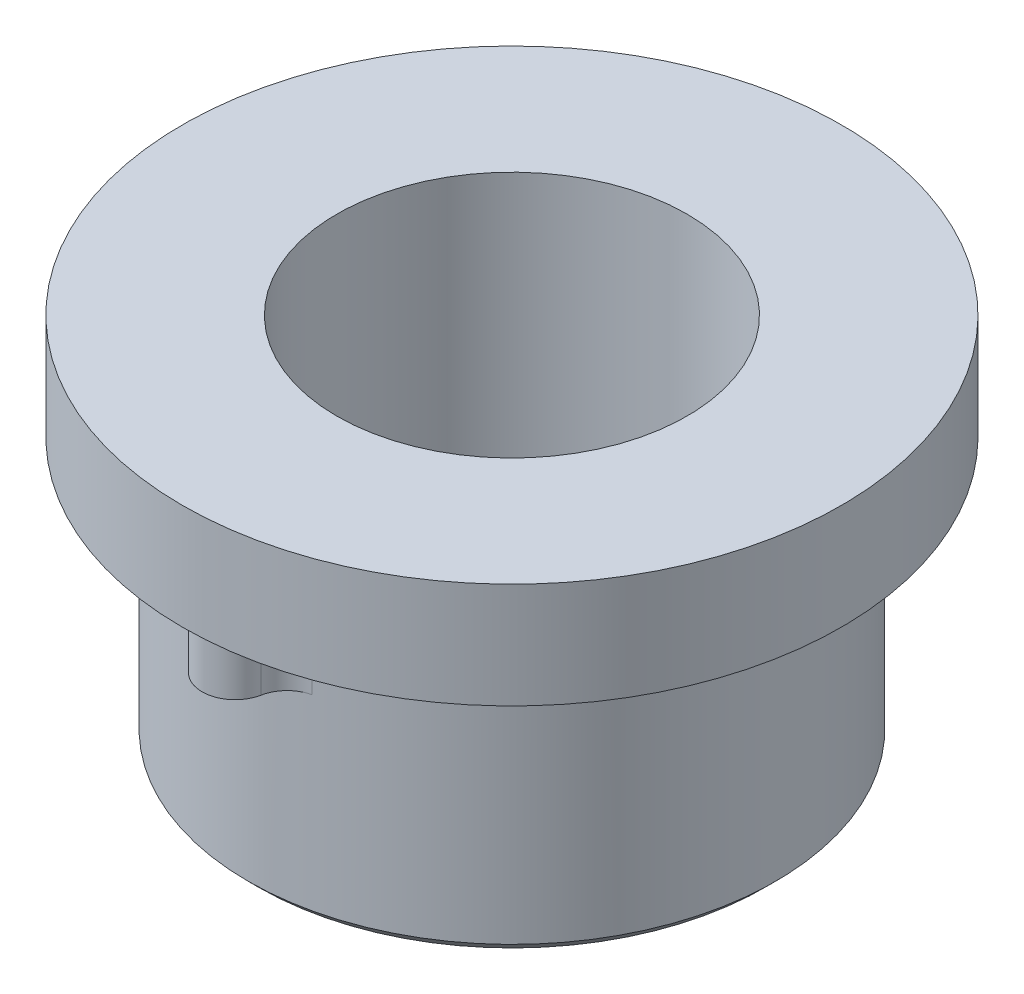
ISO-10303-21;
HEADER;
FILE_DESCRIPTION(('STEP AP214'),'2;1');
FILE_NAME('part.step','',(''),(''),'','','');
FILE_SCHEMA(('AUTOMOTIVE_DESIGN { 1 0 10303 214 1 1 1 1 }'));
ENDSEC;
DATA;
#1=APPLICATION_CONTEXT('core data for automotive mechanical design processes');
#2=APPLICATION_PROTOCOL_DEFINITION('international standard','automotive_design',2000,#1);
#3=PRODUCT_CONTEXT('',#1,'mechanical');
#4=PRODUCT('Part','Part','',(#3));
#5=PRODUCT_RELATED_PRODUCT_CATEGORY('part','',(#4));
#6=PRODUCT_DEFINITION_FORMATION('','',#4);
#7=PRODUCT_DEFINITION_CONTEXT('part definition',#1,'design');
#8=PRODUCT_DEFINITION('design','',#6,#7);
#9=PRODUCT_DEFINITION_SHAPE('','',#8);
#10=(LENGTH_UNIT() NAMED_UNIT(*) SI_UNIT(.MILLI.,.METRE.));
#11=(NAMED_UNIT(*) PLANE_ANGLE_UNIT() SI_UNIT($,.RADIAN.));
#12=(NAMED_UNIT(*) SI_UNIT($,.STERADIAN.) SOLID_ANGLE_UNIT());
#13=UNCERTAINTY_MEASURE_WITH_UNIT(LENGTH_MEASURE(1.E-05),#10,'distance_accuracy_value','');
#14=(GEOMETRIC_REPRESENTATION_CONTEXT(3) GLOBAL_UNCERTAINTY_ASSIGNED_CONTEXT((#13)) GLOBAL_UNIT_ASSIGNED_CONTEXT((#10,
#11,#12)) REPRESENTATION_CONTEXT('',''));
#15=CARTESIAN_POINT('',(0.,0.,0.));
#16=DIRECTION('',(0.,0.,1.));
#17=DIRECTION('',(1.,0.,0.));
#18=AXIS2_PLACEMENT_3D('',#15,#16,#17);
#19=CARTESIAN_POINT('',(0.,6.35,0.));
#20=DIRECTION('',(0.,-1.,0.));
#21=DIRECTION('',(0.,0.,-1.));
#22=AXIS2_PLACEMENT_3D('',#19,#20,#21);
#23=CYLINDRICAL_SURFACE('',#22,6.35);
#24=CARTESIAN_POINT('',(0.,0.253999999999997,0.));
#25=DIRECTION('',(0.,1.,0.));
#26=DIRECTION('',(0.,0.,1.));
#27=AXIS2_PLACEMENT_3D('',#24,#25,#26);
#28=CIRCLE('',#27,6.35);
#29=CARTESIAN_POINT('',(0.,0.253999999999997,6.35));
#30=VERTEX_POINT('',#29);
#31=EDGE_CURVE('E151',#30,#30,#28,.T.);
#32=ORIENTED_EDGE('',*,*,#31,.T.);
#33=EDGE_LOOP('',(#32));
#34=FACE_BOUND('',#33,.T.);
#35=CARTESIAN_POINT('',(0.,4.7625,0.));
#36=DIRECTION('',(0.,-1.,0.));
#37=DIRECTION('',(0.,0.,-1.));
#38=AXIS2_PLACEMENT_3D('',#35,#36,#37);
#39=CIRCLE('',#38,6.35);
#40=CARTESIAN_POINT('',(-1.38494922418352,4.7625,-6.19712962962963));
#41=VERTEX_POINT('',#40);
#42=CARTESIAN_POINT('',(1.38494922418352,4.7625,-6.19712962962963));
#43=VERTEX_POINT('',#42);
#44=EDGE_CURVE('E148',#41,#43,#39,.T.);
#45=ORIENTED_EDGE('',*,*,#44,.T.);
#46=DIRECTION('',(0.,-1.,0.));
#47=VECTOR('',#46,1.);
#48=CARTESIAN_POINT('',(1.38494922418352,6.35,-6.19712962962963));
#49=LINE('',#48,#47);
#50=CARTESIAN_POINT('',(1.38494922418352,6.35,-6.19712962962963));
#51=VERTEX_POINT('',#50);
#52=EDGE_CURVE('E163',#43,#51,#49,.F.);
#53=ORIENTED_EDGE('',*,*,#52,.T.);
#54=CARTESIAN_POINT('',(0.,6.35,0.));
#55=DIRECTION('',(0.,1.,0.));
#56=DIRECTION('',(0.,0.,1.));
#57=AXIS2_PLACEMENT_3D('',#54,#55,#56);
#58=CIRCLE('',#57,6.35);
#59=CARTESIAN_POINT('',(1.38494922418352,6.35,6.19712962962963));
#60=VERTEX_POINT('',#59);
#61=EDGE_CURVE('E146',#60,#51,#58,.T.);
#62=ORIENTED_EDGE('',*,*,#61,.F.);
#63=DIRECTION('',(0.,-1.,0.));
#64=VECTOR('',#63,1.);
#65=CARTESIAN_POINT('',(1.38494922418352,6.35,6.19712962962963));
#66=LINE('',#65,#64);
#67=CARTESIAN_POINT('',(1.38494922418352,4.7625,6.19712962962963));
#68=VERTEX_POINT('',#67);
#69=EDGE_CURVE('E157',#60,#68,#66,.T.);
#70=ORIENTED_EDGE('',*,*,#69,.T.);
#71=CARTESIAN_POINT('',(-1.38494922418352,4.7625,6.19712962962963));
#72=VERTEX_POINT('',#71);
#73=EDGE_CURVE('E150',#68,#72,#39,.T.);
#74=ORIENTED_EDGE('',*,*,#73,.T.);
#75=DIRECTION('',(0.,-1.,0.));
#76=VECTOR('',#75,1.);
#77=CARTESIAN_POINT('',(-1.38494922418352,6.35,6.19712962962963));
#78=LINE('',#77,#76);
#79=CARTESIAN_POINT('',(-1.38494922418352,6.35,6.19712962962963));
#80=VERTEX_POINT('',#79);
#81=EDGE_CURVE('E160',#72,#80,#78,.F.);
#82=ORIENTED_EDGE('',*,*,#81,.T.);
#83=CARTESIAN_POINT('',(-1.38494922418352,6.35,-6.19712962962963));
#84=VERTEX_POINT('',#83);
#85=EDGE_CURVE('E142',#84,#80,#58,.T.);
#86=ORIENTED_EDGE('',*,*,#85,.F.);
#87=DIRECTION('',(0.,-1.,0.));
#88=VECTOR('',#87,1.);
#89=CARTESIAN_POINT('',(-1.38494922418352,6.35,-6.19712962962963));
#90=LINE('',#89,#88);
#91=EDGE_CURVE('E104',#84,#41,#90,.T.);
#92=ORIENTED_EDGE('',*,*,#91,.T.);
#93=EDGE_LOOP('',(#45,#53,#62,#70,#74,#82,#86,#92));
#94=FACE_BOUND('',#93,.T.);
#95=ADVANCED_FACE('F33',(#34,#94),#23,.T.);
#96=CARTESIAN_POINT('',(0.,6.35,0.));
#97=DIRECTION('',(0.,1.,0.));
#98=DIRECTION('',(0.,0.,1.));
#99=AXIS2_PLACEMENT_3D('',#96,#97,#98);
#100=PLANE('',#99);
#101=CARTESIAN_POINT('',(0.,6.35,0.));
#102=DIRECTION('',(0.,1.,0.));
#103=DIRECTION('',(0.,0.,1.));
#104=AXIS2_PLACEMENT_3D('',#101,#102,#103);
#105=CIRCLE('',#104,7.9375);
#106=CARTESIAN_POINT('',(0.,6.35,7.9375));
#107=VERTEX_POINT('',#106);
#108=EDGE_CURVE('E143',#107,#107,#105,.T.);
#109=ORIENTED_EDGE('',*,*,#108,.F.);
#110=EDGE_LOOP('',(#109));
#111=FACE_BOUND('',#110,.T.);
#112=ORIENTED_EDGE('',*,*,#61,.T.);
#113=CARTESIAN_POINT('',(1.55806787720646,6.35,-6.97177083333333));
#114=DIRECTION('',(0.,1.,0.));
#115=DIRECTION('',(0.,0.,1.));
#116=AXIS2_PLACEMENT_3D('',#113,#114,#115);
#117=CIRCLE('',#116,0.79375);
#118=CARTESIAN_POINT('',(0.779033938603229,6.35,-6.81963541666667));
#119=VERTEX_POINT('',#118);
#120=EDGE_CURVE('E109',#51,#119,#117,.F.);
#121=ORIENTED_EDGE('',*,*,#120,.T.);
#122=CARTESIAN_POINT('',(0.,6.35,-6.6675));
#123=DIRECTION('',(0.,-1.,0.));
#124=DIRECTION('',(0.,0.,-1.));
#125=AXIS2_PLACEMENT_3D('',#122,#123,#124);
#126=CIRCLE('',#125,0.79375);
#127=CARTESIAN_POINT('',(-0.779033938603229,6.35,-6.81963541666667));
#128=VERTEX_POINT('',#127);
#129=EDGE_CURVE('E117',#128,#119,#126,.T.);
#130=ORIENTED_EDGE('',*,*,#129,.F.);
#131=CARTESIAN_POINT('',(-1.55806787720646,6.35,-6.97177083333333));
#132=DIRECTION('',(0.,1.,0.));
#133=DIRECTION('',(0.,0.,1.));
#134=AXIS2_PLACEMENT_3D('',#131,#132,#133);
#135=CIRCLE('',#134,0.79375);
#136=EDGE_CURVE('E98',#128,#84,#135,.F.);
#137=ORIENTED_EDGE('',*,*,#136,.T.);
#138=ORIENTED_EDGE('',*,*,#85,.T.);
#139=CARTESIAN_POINT('',(-1.55806787720646,6.35,6.97177083333333));
#140=DIRECTION('',(0.,1.,0.));
#141=DIRECTION('',(0.,0.,1.));
#142=AXIS2_PLACEMENT_3D('',#139,#140,#141);
#143=CIRCLE('',#142,0.79375);
#144=CARTESIAN_POINT('',(-0.779033938603232,6.35,6.81963541666667));
#145=VERTEX_POINT('',#144);
#146=EDGE_CURVE('E110',#80,#145,#143,.F.);
#147=ORIENTED_EDGE('',*,*,#146,.T.);
#148=CARTESIAN_POINT('',(0.,6.35,6.6675));
#149=DIRECTION('',(0.,-1.,0.));
#150=DIRECTION('',(0.,0.,-1.));
#151=AXIS2_PLACEMENT_3D('',#148,#149,#150);
#152=CIRCLE('',#151,0.79375);
#153=CARTESIAN_POINT('',(0.779033938603226,6.35,6.81963541666667));
#154=VERTEX_POINT('',#153);
#155=EDGE_CURVE('E127',#154,#145,#152,.T.);
#156=ORIENTED_EDGE('',*,*,#155,.F.);
#157=CARTESIAN_POINT('',(1.55806787720646,6.35,6.97177083333333));
#158=DIRECTION('',(0.,1.,0.));
#159=DIRECTION('',(0.,0.,1.));
#160=AXIS2_PLACEMENT_3D('',#157,#158,#159);
#161=CIRCLE('',#160,0.79375);
#162=EDGE_CURVE('E165',#154,#60,#161,.F.);
#163=ORIENTED_EDGE('',*,*,#162,.T.);
#164=EDGE_LOOP('',(#112,#121,#130,#137,#138,#147,#156,#163));
#165=FACE_BOUND('',#164,.T.);
#166=ADVANCED_FACE('F125',(#111,#165),#100,.F.);
#167=CARTESIAN_POINT('',(0.,0.,0.));
#168=DIRECTION('',(0.,1.,0.));
#169=DIRECTION('',(0.,0.,1.));
#170=AXIS2_PLACEMENT_3D('',#167,#168,#169);
#171=PLANE('',#170);
#172=CARTESIAN_POINT('',(0.,0.,0.));
#173=DIRECTION('',(0.,1.,0.));
#174=DIRECTION('',(0.,0.,1.));
#175=AXIS2_PLACEMENT_3D('',#172,#173,#174);
#176=CIRCLE('',#175,6.096);
#177=CARTESIAN_POINT('',(0.,0.,6.096));
#178=VERTEX_POINT('',#177);
#179=EDGE_CURVE('E122',#178,#178,#176,.F.);
#180=ORIENTED_EDGE('',*,*,#179,.T.);
#181=EDGE_LOOP('',(#180));
#182=FACE_BOUND('',#181,.T.);
#183=CARTESIAN_POINT('',(0.,0.,0.));
#184=DIRECTION('',(0.,1.,0.));
#185=DIRECTION('',(0.,0.,1.));
#186=AXIS2_PLACEMENT_3D('',#183,#184,#185);
#187=CIRCLE('',#186,4.2164);
#188=CARTESIAN_POINT('',(0.,0.,4.2164));
#189=VERTEX_POINT('',#188);
#190=EDGE_CURVE('E128',#189,#189,#187,.T.);
#191=ORIENTED_EDGE('',*,*,#190,.T.);
#192=EDGE_LOOP('',(#191));
#193=FACE_BOUND('',#192,.T.);
#194=ADVANCED_FACE('F210',(#182,#193),#171,.F.);
#195=CARTESIAN_POINT('',(0.,8.89,0.));
#196=DIRECTION('',(0.,-1.,0.));
#197=DIRECTION('',(0.,0.,-1.));
#198=AXIS2_PLACEMENT_3D('',#195,#196,#197);
#199=CYLINDRICAL_SURFACE('',#198,7.9375);
#200=CARTESIAN_POINT('',(0.,8.89,0.));
#201=DIRECTION('',(0.,1.,0.));
#202=DIRECTION('',(0.,0.,1.));
#203=AXIS2_PLACEMENT_3D('',#200,#201,#202);
#204=CIRCLE('',#203,7.9375);
#205=CARTESIAN_POINT('',(0.,8.89,7.9375));
#206=VERTEX_POINT('',#205);
#207=EDGE_CURVE('E139',#206,#206,#204,.T.);
#208=ORIENTED_EDGE('',*,*,#207,.F.);
#209=EDGE_LOOP('',(#208));
#210=FACE_BOUND('',#209,.T.);
#211=ORIENTED_EDGE('',*,*,#108,.T.);
#212=EDGE_LOOP('',(#211));
#213=FACE_BOUND('',#212,.T.);
#214=ADVANCED_FACE('F204',(#210,#213),#199,.T.);
#215=CARTESIAN_POINT('',(0.,8.89,0.));
#216=DIRECTION('',(0.,1.,0.));
#217=DIRECTION('',(0.,0.,1.));
#218=AXIS2_PLACEMENT_3D('',#215,#216,#217);
#219=PLANE('',#218);
#220=CARTESIAN_POINT('',(0.,8.89,0.));
#221=DIRECTION('',(0.,1.,0.));
#222=DIRECTION('',(0.,0.,1.));
#223=AXIS2_PLACEMENT_3D('',#220,#221,#222);
#224=CIRCLE('',#223,4.2164);
#225=CARTESIAN_POINT('',(0.,8.89,4.2164));
#226=VERTEX_POINT('',#225);
#227=EDGE_CURVE('E133',#226,#226,#224,.T.);
#228=ORIENTED_EDGE('',*,*,#227,.F.);
#229=EDGE_LOOP('',(#228));
#230=FACE_BOUND('',#229,.T.);
#231=ORIENTED_EDGE('',*,*,#207,.T.);
#232=EDGE_LOOP('',(#231));
#233=FACE_BOUND('',#232,.T.);
#234=ADVANCED_FACE('F201',(#230,#233),#219,.T.);
#235=CARTESIAN_POINT('',(0.,4.7625,-6.6675));
#236=DIRECTION('',(0.,1.,0.));
#237=DIRECTION('',(0.,0.,1.));
#238=AXIS2_PLACEMENT_3D('',#235,#236,#237);
#239=CYLINDRICAL_SURFACE('',#238,0.79375);
#240=ORIENTED_EDGE('',*,*,#129,.T.);
#241=DIRECTION('',(0.,1.,0.));
#242=VECTOR('',#241,1.);
#243=CARTESIAN_POINT('',(0.779033938603229,4.7625,-6.81963541666667));
#244=LINE('',#243,#242);
#245=CARTESIAN_POINT('',(0.779033938603229,4.7625,-6.81963541666667));
#246=VERTEX_POINT('',#245);
#247=EDGE_CURVE('E121',#119,#246,#244,.F.);
#248=ORIENTED_EDGE('',*,*,#247,.T.);
#249=CARTESIAN_POINT('',(0.,4.7625,-6.6675));
#250=DIRECTION('',(0.,-1.,0.));
#251=DIRECTION('',(0.,0.,-1.));
#252=AXIS2_PLACEMENT_3D('',#249,#250,#251);
#253=CIRCLE('',#252,0.79375);
#254=CARTESIAN_POINT('',(-0.779033938603229,4.7625,-6.81963541666667));
#255=VERTEX_POINT('',#254);
#256=EDGE_CURVE('E120',#255,#246,#253,.T.);
#257=ORIENTED_EDGE('',*,*,#256,.F.);
#258=DIRECTION('',(0.,1.,0.));
#259=VECTOR('',#258,1.);
#260=CARTESIAN_POINT('',(-0.779033938603229,4.7625,-6.81963541666667));
#261=LINE('',#260,#259);
#262=EDGE_CURVE('E102',#255,#128,#261,.T.);
#263=ORIENTED_EDGE('',*,*,#262,.T.);
#264=EDGE_LOOP('',(#240,#248,#257,#263));
#265=FACE_BOUND('',#264,.T.);
#266=ADVANCED_FACE('F115',(#265),#239,.T.);
#267=CARTESIAN_POINT('',(0.,4.7625,-6.6675));
#268=DIRECTION('',(0.,-1.,0.));
#269=DIRECTION('',(0.,0.,-1.));
#270=AXIS2_PLACEMENT_3D('',#267,#268,#269);
#271=PLANE('',#270);
#272=ORIENTED_EDGE('',*,*,#44,.F.);
#273=CARTESIAN_POINT('',(-1.55806787720646,4.7625,-6.97177083333333));
#274=DIRECTION('',(0.,-1.,0.));
#275=DIRECTION('',(0.,0.,-1.));
#276=AXIS2_PLACEMENT_3D('',#273,#274,#275);
#277=CIRCLE('',#276,0.79375);
#278=EDGE_CURVE('E177',#41,#255,#277,.F.);
#279=ORIENTED_EDGE('',*,*,#278,.T.);
#280=ORIENTED_EDGE('',*,*,#256,.T.);
#281=CARTESIAN_POINT('',(1.55806787720646,4.7625,-6.97177083333333));
#282=DIRECTION('',(0.,-1.,0.));
#283=DIRECTION('',(0.,0.,-1.));
#284=AXIS2_PLACEMENT_3D('',#281,#282,#283);
#285=CIRCLE('',#284,0.79375);
#286=EDGE_CURVE('E174',#246,#43,#285,.F.);
#287=ORIENTED_EDGE('',*,*,#286,.T.);
#288=EDGE_LOOP('',(#272,#279,#280,#287));
#289=FACE_BOUND('',#288,.T.);
#290=ADVANCED_FACE('F193',(#289),#271,.T.);
#291=ORIENTED_EDGE('',*,*,#73,.F.);
#292=CARTESIAN_POINT('',(1.55806787720646,4.7625,6.97177083333333));
#293=DIRECTION('',(0.,-1.,0.));
#294=DIRECTION('',(0.,0.,-1.));
#295=AXIS2_PLACEMENT_3D('',#292,#293,#294);
#296=CIRCLE('',#295,0.79375);
#297=CARTESIAN_POINT('',(0.779033938603226,4.7625,6.81963541666667));
#298=VERTEX_POINT('',#297);
#299=EDGE_CURVE('E11',#68,#298,#296,.F.);
#300=ORIENTED_EDGE('',*,*,#299,.T.);
#301=CARTESIAN_POINT('',(0.,4.7625,6.6675));
#302=DIRECTION('',(0.,-1.,0.));
#303=DIRECTION('',(0.,0.,-1.));
#304=AXIS2_PLACEMENT_3D('',#301,#302,#303);
#305=CIRCLE('',#304,0.79375);
#306=CARTESIAN_POINT('',(-0.779033938603232,4.7625,6.81963541666667));
#307=VERTEX_POINT('',#306);
#308=EDGE_CURVE('E136',#298,#307,#305,.T.);
#309=ORIENTED_EDGE('',*,*,#308,.T.);
#310=CARTESIAN_POINT('',(-1.55806787720646,4.7625,6.97177083333333));
#311=DIRECTION('',(0.,-1.,0.));
#312=DIRECTION('',(0.,0.,-1.));
#313=AXIS2_PLACEMENT_3D('',#310,#311,#312);
#314=CIRCLE('',#313,0.79375);
#315=EDGE_CURVE('E41',#307,#72,#314,.F.);
#316=ORIENTED_EDGE('',*,*,#315,.T.);
#317=EDGE_LOOP('',(#291,#300,#309,#316));
#318=FACE_BOUND('',#317,.T.);
#319=ADVANCED_FACE('F178',(#318),#271,.T.);
#320=CARTESIAN_POINT('',(0.,4.7625,6.6675));
#321=DIRECTION('',(0.,1.,0.));
#322=DIRECTION('',(0.,0.,1.));
#323=AXIS2_PLACEMENT_3D('',#320,#321,#322);
#324=CYLINDRICAL_SURFACE('',#323,0.79375);
#325=ORIENTED_EDGE('',*,*,#155,.T.);
#326=DIRECTION('',(0.,1.,0.));
#327=VECTOR('',#326,1.);
#328=CARTESIAN_POINT('',(-0.779033938603232,4.7625,6.81963541666667));
#329=LINE('',#328,#327);
#330=EDGE_CURVE('E172',#145,#307,#329,.F.);
#331=ORIENTED_EDGE('',*,*,#330,.T.);
#332=ORIENTED_EDGE('',*,*,#308,.F.);
#333=DIRECTION('',(0.,1.,0.));
#334=VECTOR('',#333,1.);
#335=CARTESIAN_POINT('',(0.779033938603226,4.7625,6.81963541666667));
#336=LINE('',#335,#334);
#337=EDGE_CURVE('E169',#298,#154,#336,.T.);
#338=ORIENTED_EDGE('',*,*,#337,.T.);
#339=EDGE_LOOP('',(#325,#331,#332,#338));
#340=FACE_BOUND('',#339,.T.);
#341=ADVANCED_FACE('F184',(#340),#324,.T.);
#342=CARTESIAN_POINT('',(0.,8.89,0.));
#343=DIRECTION('',(0.,1.,0.));
#344=DIRECTION('',(0.,0.,1.));
#345=AXIS2_PLACEMENT_3D('',#342,#343,#344);
#346=CYLINDRICAL_SURFACE('',#345,4.2164);
#347=ORIENTED_EDGE('',*,*,#227,.T.);
#348=EDGE_LOOP('',(#347));
#349=FACE_BOUND('',#348,.T.);
#350=ORIENTED_EDGE('',*,*,#190,.F.);
#351=EDGE_LOOP('',(#350));
#352=FACE_BOUND('',#351,.T.);
#353=ADVANCED_FACE('F198',(#349,#352),#346,.F.);
#354=CARTESIAN_POINT('',(0.,0.253999999999997,0.));
#355=DIRECTION('',(0.,1.,0.));
#356=DIRECTION('',(0.,0.,1.));
#357=AXIS2_PLACEMENT_3D('',#354,#355,#356);
#358=CONICAL_SURFACE('',#357,6.35,0.785398163397445);
#359=ORIENTED_EDGE('',*,*,#179,.F.);
#360=EDGE_LOOP('',(#359));
#361=FACE_BOUND('',#360,.T.);
#362=ORIENTED_EDGE('',*,*,#31,.F.);
#363=EDGE_LOOP('',(#362));
#364=FACE_BOUND('',#363,.T.);
#365=ADVANCED_FACE('F227',(#361,#364),#358,.T.);
#366=CARTESIAN_POINT('',(1.55806787720646,6.35,-6.97177083333333));
#367=DIRECTION('',(0.,1.,0.));
#368=DIRECTION('',(0.,0.,1.));
#369=AXIS2_PLACEMENT_3D('',#366,#367,#368);
#370=CYLINDRICAL_SURFACE('',#369,0.79375);
#371=ORIENTED_EDGE('',*,*,#120,.F.);
#372=ORIENTED_EDGE('',*,*,#52,.F.);
#373=ORIENTED_EDGE('',*,*,#286,.F.);
#374=ORIENTED_EDGE('',*,*,#247,.F.);
#375=EDGE_LOOP('',(#371,#372,#373,#374));
#376=FACE_BOUND('',#375,.T.);
#377=ADVANCED_FACE('F191',(#376),#370,.F.);
#378=CARTESIAN_POINT('',(-1.55806787720646,6.35,-6.97177083333333));
#379=DIRECTION('',(0.,-1.,0.));
#380=DIRECTION('',(0.,0.,-1.));
#381=AXIS2_PLACEMENT_3D('',#378,#379,#380);
#382=CYLINDRICAL_SURFACE('',#381,0.79375);
#383=ORIENTED_EDGE('',*,*,#278,.F.);
#384=ORIENTED_EDGE('',*,*,#91,.F.);
#385=ORIENTED_EDGE('',*,*,#136,.F.);
#386=ORIENTED_EDGE('',*,*,#262,.F.);
#387=EDGE_LOOP('',(#383,#384,#385,#386));
#388=FACE_BOUND('',#387,.T.);
#389=ADVANCED_FACE('F101',(#388),#382,.F.);
#390=CARTESIAN_POINT('',(-1.55806787720646,6.35,6.97177083333333));
#391=DIRECTION('',(0.,1.,0.));
#392=DIRECTION('',(0.,0.,1.));
#393=AXIS2_PLACEMENT_3D('',#390,#391,#392);
#394=CYLINDRICAL_SURFACE('',#393,0.79375);
#395=ORIENTED_EDGE('',*,*,#146,.F.);
#396=ORIENTED_EDGE('',*,*,#81,.F.);
#397=ORIENTED_EDGE('',*,*,#315,.F.);
#398=ORIENTED_EDGE('',*,*,#330,.F.);
#399=EDGE_LOOP('',(#395,#396,#397,#398));
#400=FACE_BOUND('',#399,.T.);
#401=ADVANCED_FACE('F180',(#400),#394,.F.);
#402=CARTESIAN_POINT('',(1.55806787720646,6.35,6.97177083333333));
#403=DIRECTION('',(0.,-1.,0.));
#404=DIRECTION('',(0.,0.,-1.));
#405=AXIS2_PLACEMENT_3D('',#402,#403,#404);
#406=CYLINDRICAL_SURFACE('',#405,0.79375);
#407=ORIENTED_EDGE('',*,*,#299,.F.);
#408=ORIENTED_EDGE('',*,*,#69,.F.);
#409=ORIENTED_EDGE('',*,*,#162,.F.);
#410=ORIENTED_EDGE('',*,*,#337,.F.);
#411=EDGE_LOOP('',(#407,#408,#409,#410));
#412=FACE_BOUND('',#411,.T.);
#413=ADVANCED_FACE('F35',(#412),#406,.F.);
#414=CLOSED_SHELL('',(#95,#166,#194,#214,#234,#266,#290,#319,#341,#353,#365,#377,#389,#401,#413));
#415=MANIFOLD_SOLID_BREP('B2',#414);
#416=ADVANCED_BREP_SHAPE_REPRESENTATION('',(#18,#415),#14);
#417=SHAPE_DEFINITION_REPRESENTATION(#9,#416);
ENDSEC;
END-ISO-10303-21;
